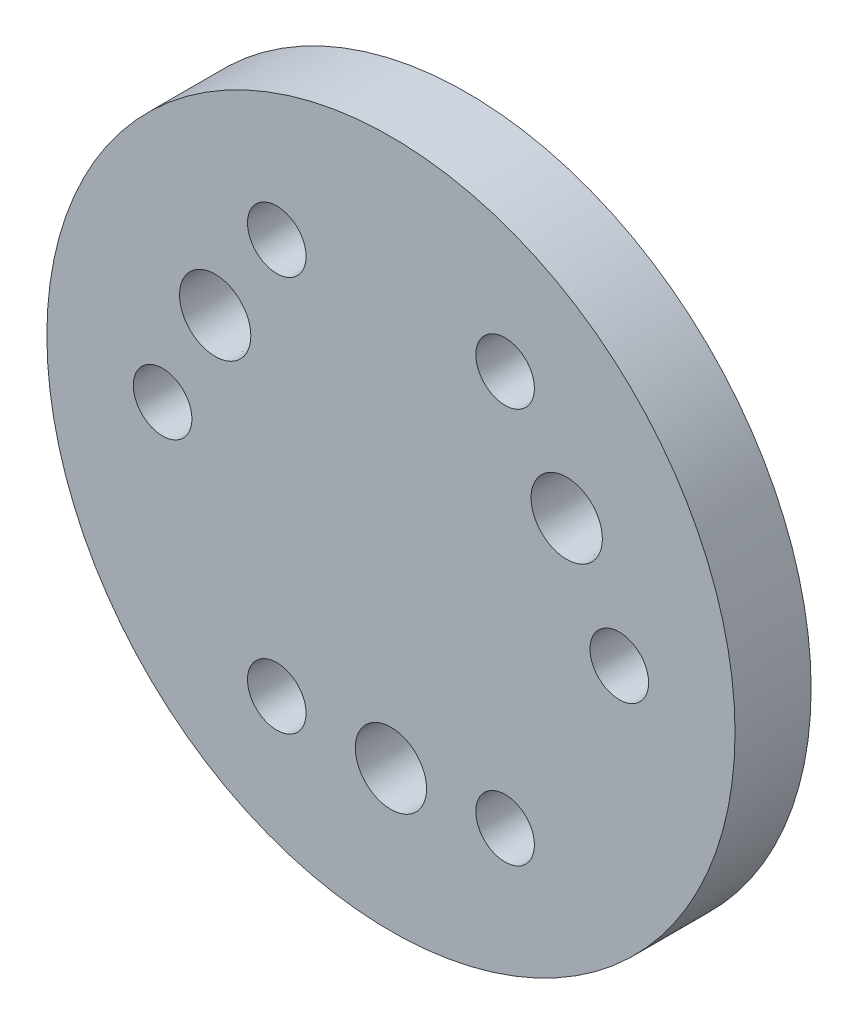
ISO-10303-21;
HEADER;
FILE_DESCRIPTION(('STEP AP214'),'2;1');
FILE_NAME('part.step','',(''),(''),'','','');
FILE_SCHEMA(('AUTOMOTIVE_DESIGN { 1 0 10303 214 1 1 1 1 }'));
ENDSEC;
DATA;
#1=APPLICATION_CONTEXT('core data for automotive mechanical design processes');
#2=APPLICATION_PROTOCOL_DEFINITION('international standard','automotive_design',2000,#1);
#3=PRODUCT_CONTEXT('',#1,'mechanical');
#4=PRODUCT('Part','Part','',(#3));
#5=PRODUCT_RELATED_PRODUCT_CATEGORY('part','',(#4));
#6=PRODUCT_DEFINITION_FORMATION('','',#4);
#7=PRODUCT_DEFINITION_CONTEXT('part definition',#1,'design');
#8=PRODUCT_DEFINITION('design','',#6,#7);
#9=PRODUCT_DEFINITION_SHAPE('','',#8);
#10=(LENGTH_UNIT() NAMED_UNIT(*) SI_UNIT(.MILLI.,.METRE.));
#11=(NAMED_UNIT(*) PLANE_ANGLE_UNIT() SI_UNIT($,.RADIAN.));
#12=(NAMED_UNIT(*) SI_UNIT($,.STERADIAN.) SOLID_ANGLE_UNIT());
#13=UNCERTAINTY_MEASURE_WITH_UNIT(LENGTH_MEASURE(1.E-05),#10,'distance_accuracy_value','');
#14=(GEOMETRIC_REPRESENTATION_CONTEXT(3) GLOBAL_UNCERTAINTY_ASSIGNED_CONTEXT((#13)) GLOBAL_UNIT_ASSIGNED_CONTEXT((#10,
#11,#12)) REPRESENTATION_CONTEXT('',''));
#15=CARTESIAN_POINT('',(0.,0.,0.));
#16=DIRECTION('',(0.,0.,1.));
#17=DIRECTION('',(1.,0.,0.));
#18=AXIS2_PLACEMENT_3D('',#15,#16,#17);
#19=CARTESIAN_POINT('',(0.,0.,6.));
#20=DIRECTION('',(0.,0.,-1.));
#21=DIRECTION('',(-1.,0.,0.));
#22=AXIS2_PLACEMENT_3D('',#19,#20,#21);
#23=CYLINDRICAL_SURFACE('',#22,27.125);
#24=CARTESIAN_POINT('',(0.,0.,6.));
#25=DIRECTION('',(0.,0.,1.));
#26=DIRECTION('',(1.,0.,0.));
#27=AXIS2_PLACEMENT_3D('',#24,#25,#26);
#28=CIRCLE('',#27,27.125);
#29=CARTESIAN_POINT('',(27.125,0.,6.));
#30=VERTEX_POINT('',#29);
#31=EDGE_CURVE('E10',#30,#30,#28,.T.);
#32=ORIENTED_EDGE('',*,*,#31,.F.);
#33=EDGE_LOOP('',(#32));
#34=FACE_BOUND('',#33,.T.);
#35=CARTESIAN_POINT('',(0.,0.,0.));
#36=DIRECTION('',(0.,0.,1.));
#37=DIRECTION('',(1.,0.,0.));
#38=AXIS2_PLACEMENT_3D('',#35,#36,#37);
#39=CIRCLE('',#38,27.125);
#40=CARTESIAN_POINT('',(27.125,0.,0.));
#41=VERTEX_POINT('',#40);
#42=EDGE_CURVE('E45',#41,#41,#39,.T.);
#43=ORIENTED_EDGE('',*,*,#42,.T.);
#44=EDGE_LOOP('',(#43));
#45=FACE_BOUND('',#44,.T.);
#46=ADVANCED_FACE('F42',(#34,#45),#23,.T.);
#47=CARTESIAN_POINT('',(0.,0.,6.));
#48=DIRECTION('',(0.,0.,1.));
#49=DIRECTION('',(1.,0.,0.));
#50=AXIS2_PLACEMENT_3D('',#47,#48,#49);
#51=PLANE('',#50);
#52=CARTESIAN_POINT('',(18.,0.,6.));
#53=DIRECTION('',(0.,0.,1.));
#54=DIRECTION('',(1.,0.,0.));
#55=AXIS2_PLACEMENT_3D('',#52,#53,#54);
#56=CIRCLE('',#55,2.30952461695048);
#57=CARTESIAN_POINT('',(20.3095246169505,0.,6.));
#58=VERTEX_POINT('',#57);
#59=EDGE_CURVE('E72',#58,#58,#56,.T.);
#60=ORIENTED_EDGE('',*,*,#59,.F.);
#61=EDGE_LOOP('',(#60));
#62=FACE_BOUND('',#61,.T.);
#63=CARTESIAN_POINT('',(-9.,15.5884572681199,6.));
#64=DIRECTION('',(0.,0.,1.));
#65=DIRECTION('',(1.,0.,0.));
#66=AXIS2_PLACEMENT_3D('',#63,#64,#65);
#67=CIRCLE('',#66,2.30952461695049);
#68=CARTESIAN_POINT('',(-6.69047538304951,15.5884572681199,6.));
#69=VERTEX_POINT('',#68);
#70=EDGE_CURVE('E67',#69,#69,#67,.T.);
#71=ORIENTED_EDGE('',*,*,#70,.F.);
#72=EDGE_LOOP('',(#71));
#73=FACE_BOUND('',#72,.T.);
#74=CARTESIAN_POINT('',(-13.856406460551,8.,6.));
#75=DIRECTION('',(0.,0.,1.));
#76=DIRECTION('',(1.,0.,0.));
#77=AXIS2_PLACEMENT_3D('',#74,#75,#76);
#78=CIRCLE('',#77,2.80952461695049);
#79=CARTESIAN_POINT('',(-11.0468818436005,8.,6.));
#80=VERTEX_POINT('',#79);
#81=EDGE_CURVE('E60',#80,#80,#78,.T.);
#82=ORIENTED_EDGE('',*,*,#81,.F.);
#83=EDGE_LOOP('',(#82));
#84=FACE_BOUND('',#83,.T.);
#85=CARTESIAN_POINT('',(13.856406460551,8.,6.));
#86=DIRECTION('',(0.,0.,1.));
#87=DIRECTION('',(1.,0.,0.));
#88=AXIS2_PLACEMENT_3D('',#85,#86,#87);
#89=CIRCLE('',#88,2.80952461695049);
#90=CARTESIAN_POINT('',(16.6659310775015,8.,6.));
#91=VERTEX_POINT('',#90);
#92=EDGE_CURVE('E59',#91,#91,#89,.T.);
#93=ORIENTED_EDGE('',*,*,#92,.F.);
#94=EDGE_LOOP('',(#93));
#95=FACE_BOUND('',#94,.T.);
#96=CARTESIAN_POINT('',(-18.,0.,6.));
#97=DIRECTION('',(0.,0.,1.));
#98=DIRECTION('',(1.,0.,0.));
#99=AXIS2_PLACEMENT_3D('',#96,#97,#98);
#100=CIRCLE('',#99,2.30952461695048);
#101=CARTESIAN_POINT('',(-15.6904753830495,0.,6.));
#102=VERTEX_POINT('',#101);
#103=EDGE_CURVE('E79',#102,#102,#100,.T.);
#104=ORIENTED_EDGE('',*,*,#103,.F.);
#105=EDGE_LOOP('',(#104));
#106=FACE_BOUND('',#105,.T.);
#107=CARTESIAN_POINT('',(-9.,-15.5884572681199,6.));
#108=DIRECTION('',(0.,0.,1.));
#109=DIRECTION('',(1.,0.,0.));
#110=AXIS2_PLACEMENT_3D('',#107,#108,#109);
#111=CIRCLE('',#110,2.30952461695049);
#112=CARTESIAN_POINT('',(-6.69047538304951,-15.5884572681199,6.));
#113=VERTEX_POINT('',#112);
#114=EDGE_CURVE('E97',#113,#113,#111,.T.);
#115=ORIENTED_EDGE('',*,*,#114,.F.);
#116=EDGE_LOOP('',(#115));
#117=FACE_BOUND('',#116,.T.);
#118=CARTESIAN_POINT('',(9.,-15.5884572681199,6.));
#119=DIRECTION('',(0.,0.,1.));
#120=DIRECTION('',(1.,0.,0.));
#121=AXIS2_PLACEMENT_3D('',#118,#119,#120);
#122=CIRCLE('',#121,2.30952461695049);
#123=CARTESIAN_POINT('',(11.3095246169505,-15.5884572681199,6.));
#124=VERTEX_POINT('',#123);
#125=EDGE_CURVE('E91',#124,#124,#122,.T.);
#126=ORIENTED_EDGE('',*,*,#125,.F.);
#127=EDGE_LOOP('',(#126));
#128=FACE_BOUND('',#127,.T.);
#129=CARTESIAN_POINT('',(9.,15.5884572681199,6.));
#130=DIRECTION('',(0.,0.,1.));
#131=DIRECTION('',(1.,0.,0.));
#132=AXIS2_PLACEMENT_3D('',#129,#130,#131);
#133=CIRCLE('',#132,2.30952461695048);
#134=CARTESIAN_POINT('',(11.3095246169505,15.5884572681199,6.));
#135=VERTEX_POINT('',#134);
#136=EDGE_CURVE('E84',#135,#135,#133,.T.);
#137=ORIENTED_EDGE('',*,*,#136,.F.);
#138=EDGE_LOOP('',(#137));
#139=FACE_BOUND('',#138,.T.);
#140=CARTESIAN_POINT('',(0.,-16.,6.));
#141=DIRECTION('',(0.,0.,1.));
#142=DIRECTION('',(1.,0.,0.));
#143=AXIS2_PLACEMENT_3D('',#140,#141,#142);
#144=CIRCLE('',#143,2.80952461695049);
#145=CARTESIAN_POINT('',(2.80952461695049,-16.,6.));
#146=VERTEX_POINT('',#145);
#147=EDGE_CURVE('E52',#146,#146,#144,.T.);
#148=ORIENTED_EDGE('',*,*,#147,.F.);
#149=EDGE_LOOP('',(#148));
#150=FACE_BOUND('',#149,.T.);
#151=ORIENTED_EDGE('',*,*,#31,.T.);
#152=EDGE_LOOP('',(#151));
#153=FACE_BOUND('',#152,.T.);
#154=ADVANCED_FACE('F128',(#62,#73,#84,#95,#106,#117,#128,#139,#150,#153),#51,.T.);
#155=CARTESIAN_POINT('',(0.,0.,0.));
#156=DIRECTION('',(0.,0.,1.));
#157=DIRECTION('',(1.,0.,0.));
#158=AXIS2_PLACEMENT_3D('',#155,#156,#157);
#159=PLANE('',#158);
#160=CARTESIAN_POINT('',(18.,0.,0.));
#161=DIRECTION('',(0.,0.,1.));
#162=DIRECTION('',(1.,0.,0.));
#163=AXIS2_PLACEMENT_3D('',#160,#161,#162);
#164=CIRCLE('',#163,2.1);
#165=CARTESIAN_POINT('',(20.1,0.,0.));
#166=VERTEX_POINT('',#165);
#167=EDGE_CURVE('E76',#166,#166,#164,.T.);
#168=ORIENTED_EDGE('',*,*,#167,.T.);
#169=EDGE_LOOP('',(#168));
#170=FACE_BOUND('',#169,.T.);
#171=CARTESIAN_POINT('',(-9.,15.5884572681199,0.));
#172=DIRECTION('',(0.,0.,1.));
#173=DIRECTION('',(1.,0.,0.));
#174=AXIS2_PLACEMENT_3D('',#171,#172,#173);
#175=CIRCLE('',#174,2.1);
#176=CARTESIAN_POINT('',(-6.9,15.5884572681199,0.));
#177=VERTEX_POINT('',#176);
#178=EDGE_CURVE('E75',#177,#177,#175,.T.);
#179=ORIENTED_EDGE('',*,*,#178,.T.);
#180=EDGE_LOOP('',(#179));
#181=FACE_BOUND('',#180,.T.);
#182=CARTESIAN_POINT('',(-13.856406460551,8.,0.));
#183=DIRECTION('',(0.,0.,1.));
#184=DIRECTION('',(1.,0.,0.));
#185=AXIS2_PLACEMENT_3D('',#182,#183,#184);
#186=CIRCLE('',#185,2.6);
#187=CARTESIAN_POINT('',(-11.256406460551,8.,0.));
#188=VERTEX_POINT('',#187);
#189=EDGE_CURVE('E64',#188,#188,#186,.T.);
#190=ORIENTED_EDGE('',*,*,#189,.T.);
#191=EDGE_LOOP('',(#190));
#192=FACE_BOUND('',#191,.T.);
#193=CARTESIAN_POINT('',(13.856406460551,8.,0.));
#194=DIRECTION('',(0.,0.,1.));
#195=DIRECTION('',(1.,0.,0.));
#196=AXIS2_PLACEMENT_3D('',#193,#194,#195);
#197=CIRCLE('',#196,2.6);
#198=CARTESIAN_POINT('',(16.456406460551,8.,0.));
#199=VERTEX_POINT('',#198);
#200=EDGE_CURVE('E63',#199,#199,#197,.T.);
#201=ORIENTED_EDGE('',*,*,#200,.T.);
#202=EDGE_LOOP('',(#201));
#203=FACE_BOUND('',#202,.T.);
#204=CARTESIAN_POINT('',(-18.,0.,0.));
#205=DIRECTION('',(0.,0.,1.));
#206=DIRECTION('',(1.,0.,0.));
#207=AXIS2_PLACEMENT_3D('',#204,#205,#206);
#208=CIRCLE('',#207,2.1);
#209=CARTESIAN_POINT('',(-15.9,0.,0.));
#210=VERTEX_POINT('',#209);
#211=EDGE_CURVE('E100',#210,#210,#208,.T.);
#212=ORIENTED_EDGE('',*,*,#211,.T.);
#213=EDGE_LOOP('',(#212));
#214=FACE_BOUND('',#213,.T.);
#215=CARTESIAN_POINT('',(-9.,-15.5884572681199,0.));
#216=DIRECTION('',(0.,0.,1.));
#217=DIRECTION('',(1.,0.,0.));
#218=AXIS2_PLACEMENT_3D('',#215,#216,#217);
#219=CIRCLE('',#218,2.1);
#220=CARTESIAN_POINT('',(-6.9,-15.5884572681199,0.));
#221=VERTEX_POINT('',#220);
#222=EDGE_CURVE('E94',#221,#221,#219,.T.);
#223=ORIENTED_EDGE('',*,*,#222,.T.);
#224=EDGE_LOOP('',(#223));
#225=FACE_BOUND('',#224,.T.);
#226=CARTESIAN_POINT('',(9.,-15.5884572681199,0.));
#227=DIRECTION('',(0.,0.,1.));
#228=DIRECTION('',(1.,0.,0.));
#229=AXIS2_PLACEMENT_3D('',#226,#227,#228);
#230=CIRCLE('',#229,2.1);
#231=CARTESIAN_POINT('',(11.1,-15.5884572681199,0.));
#232=VERTEX_POINT('',#231);
#233=EDGE_CURVE('E87',#232,#232,#230,.T.);
#234=ORIENTED_EDGE('',*,*,#233,.T.);
#235=EDGE_LOOP('',(#234));
#236=FACE_BOUND('',#235,.T.);
#237=CARTESIAN_POINT('',(9.,15.5884572681199,0.));
#238=DIRECTION('',(0.,0.,1.));
#239=DIRECTION('',(1.,0.,0.));
#240=AXIS2_PLACEMENT_3D('',#237,#238,#239);
#241=CIRCLE('',#240,2.1);
#242=CARTESIAN_POINT('',(11.1,15.5884572681199,0.));
#243=VERTEX_POINT('',#242);
#244=EDGE_CURVE('E88',#243,#243,#241,.T.);
#245=ORIENTED_EDGE('',*,*,#244,.T.);
#246=EDGE_LOOP('',(#245));
#247=FACE_BOUND('',#246,.T.);
#248=CARTESIAN_POINT('',(0.,-16.,0.));
#249=DIRECTION('',(0.,0.,1.));
#250=DIRECTION('',(1.,0.,0.));
#251=AXIS2_PLACEMENT_3D('',#248,#249,#250);
#252=CIRCLE('',#251,2.6);
#253=CARTESIAN_POINT('',(2.6,-16.,0.));
#254=VERTEX_POINT('',#253);
#255=EDGE_CURVE('E56',#254,#254,#252,.T.);
#256=ORIENTED_EDGE('',*,*,#255,.T.);
#257=EDGE_LOOP('',(#256));
#258=FACE_BOUND('',#257,.T.);
#259=ORIENTED_EDGE('',*,*,#42,.F.);
#260=EDGE_LOOP('',(#259));
#261=FACE_BOUND('',#260,.T.);
#262=ADVANCED_FACE('F108',(#170,#181,#192,#203,#214,#225,#236,#247,#258,#261),#159,.F.);
#263=CARTESIAN_POINT('',(0.,-16.,0.));
#264=DIRECTION('',(0.,0.,1.));
#265=DIRECTION('',(1.,0.,0.));
#266=AXIS2_PLACEMENT_3D('',#263,#264,#265);
#267=CONICAL_SURFACE('',#266,2.6,0.0349065850398867);
#268=ORIENTED_EDGE('',*,*,#147,.T.);
#269=EDGE_LOOP('',(#268));
#270=FACE_BOUND('',#269,.T.);
#271=ORIENTED_EDGE('',*,*,#255,.F.);
#272=EDGE_LOOP('',(#271));
#273=FACE_BOUND('',#272,.T.);
#274=ADVANCED_FACE('F139',(#270,#273),#267,.F.);
#275=CARTESIAN_POINT('',(9.,15.5884572681199,0.));
#276=DIRECTION('',(0.,0.,1.));
#277=DIRECTION('',(1.,0.,0.));
#278=AXIS2_PLACEMENT_3D('',#275,#276,#277);
#279=CONICAL_SURFACE('',#278,2.1,0.0349065850398867);
#280=ORIENTED_EDGE('',*,*,#136,.T.);
#281=EDGE_LOOP('',(#280));
#282=FACE_BOUND('',#281,.T.);
#283=ORIENTED_EDGE('',*,*,#244,.F.);
#284=EDGE_LOOP('',(#283));
#285=FACE_BOUND('',#284,.T.);
#286=ADVANCED_FACE('F144',(#282,#285),#279,.F.);
#287=CARTESIAN_POINT('',(9.,-15.5884572681199,0.));
#288=DIRECTION('',(0.,0.,1.));
#289=DIRECTION('',(1.,0.,0.));
#290=AXIS2_PLACEMENT_3D('',#287,#288,#289);
#291=CONICAL_SURFACE('',#290,2.1,0.0349065850398867);
#292=ORIENTED_EDGE('',*,*,#125,.T.);
#293=EDGE_LOOP('',(#292));
#294=FACE_BOUND('',#293,.T.);
#295=ORIENTED_EDGE('',*,*,#233,.F.);
#296=EDGE_LOOP('',(#295));
#297=FACE_BOUND('',#296,.T.);
#298=ADVANCED_FACE('F124',(#294,#297),#291,.F.);
#299=CARTESIAN_POINT('',(-9.,-15.5884572681199,0.));
#300=DIRECTION('',(0.,0.,1.));
#301=DIRECTION('',(1.,0.,0.));
#302=AXIS2_PLACEMENT_3D('',#299,#300,#301);
#303=CONICAL_SURFACE('',#302,2.1,0.0349065850398867);
#304=ORIENTED_EDGE('',*,*,#114,.T.);
#305=EDGE_LOOP('',(#304));
#306=FACE_BOUND('',#305,.T.);
#307=ORIENTED_EDGE('',*,*,#222,.F.);
#308=EDGE_LOOP('',(#307));
#309=FACE_BOUND('',#308,.T.);
#310=ADVANCED_FACE('F114',(#306,#309),#303,.F.);
#311=CARTESIAN_POINT('',(-18.,0.,0.));
#312=DIRECTION('',(0.,0.,1.));
#313=DIRECTION('',(1.,0.,0.));
#314=AXIS2_PLACEMENT_3D('',#311,#312,#313);
#315=CONICAL_SURFACE('',#314,2.1,0.0349065850398867);
#316=ORIENTED_EDGE('',*,*,#103,.T.);
#317=EDGE_LOOP('',(#316));
#318=FACE_BOUND('',#317,.T.);
#319=ORIENTED_EDGE('',*,*,#211,.F.);
#320=EDGE_LOOP('',(#319));
#321=FACE_BOUND('',#320,.T.);
#322=ADVANCED_FACE('F111',(#318,#321),#315,.F.);
#323=CARTESIAN_POINT('',(13.856406460551,8.,0.));
#324=DIRECTION('',(0.,0.,1.));
#325=DIRECTION('',(1.,0.,0.));
#326=AXIS2_PLACEMENT_3D('',#323,#324,#325);
#327=CONICAL_SURFACE('',#326,2.6,0.0349065850398867);
#328=ORIENTED_EDGE('',*,*,#92,.T.);
#329=EDGE_LOOP('',(#328));
#330=FACE_BOUND('',#329,.T.);
#331=ORIENTED_EDGE('',*,*,#200,.F.);
#332=EDGE_LOOP('',(#331));
#333=FACE_BOUND('',#332,.T.);
#334=ADVANCED_FACE('F113',(#330,#333),#327,.F.);
#335=CARTESIAN_POINT('',(-13.856406460551,8.,0.));
#336=DIRECTION('',(0.,0.,1.));
#337=DIRECTION('',(1.,0.,0.));
#338=AXIS2_PLACEMENT_3D('',#335,#336,#337);
#339=CONICAL_SURFACE('',#338,2.6,0.0349065850398867);
#340=ORIENTED_EDGE('',*,*,#81,.T.);
#341=EDGE_LOOP('',(#340));
#342=FACE_BOUND('',#341,.T.);
#343=ORIENTED_EDGE('',*,*,#189,.F.);
#344=EDGE_LOOP('',(#343));
#345=FACE_BOUND('',#344,.T.);
#346=ADVANCED_FACE('F121',(#342,#345),#339,.F.);
#347=CARTESIAN_POINT('',(-9.,15.5884572681199,0.));
#348=DIRECTION('',(0.,0.,1.));
#349=DIRECTION('',(1.,0.,0.));
#350=AXIS2_PLACEMENT_3D('',#347,#348,#349);
#351=CONICAL_SURFACE('',#350,2.1,0.0349065850398867);
#352=ORIENTED_EDGE('',*,*,#70,.T.);
#353=EDGE_LOOP('',(#352));
#354=FACE_BOUND('',#353,.T.);
#355=ORIENTED_EDGE('',*,*,#178,.F.);
#356=EDGE_LOOP('',(#355));
#357=FACE_BOUND('',#356,.T.);
#358=ADVANCED_FACE('F150',(#354,#357),#351,.F.);
#359=CARTESIAN_POINT('',(18.,0.,0.));
#360=DIRECTION('',(0.,0.,1.));
#361=DIRECTION('',(1.,0.,0.));
#362=AXIS2_PLACEMENT_3D('',#359,#360,#361);
#363=CONICAL_SURFACE('',#362,2.1,0.0349065850398867);
#364=ORIENTED_EDGE('',*,*,#59,.T.);
#365=EDGE_LOOP('',(#364));
#366=FACE_BOUND('',#365,.T.);
#367=ORIENTED_EDGE('',*,*,#167,.F.);
#368=EDGE_LOOP('',(#367));
#369=FACE_BOUND('',#368,.T.);
#370=ADVANCED_FACE('F153',(#366,#369),#363,.F.);
#371=CLOSED_SHELL('',(#46,#154,#262,#274,#286,#298,#310,#322,#334,#346,#358,#370));
#372=MANIFOLD_SOLID_BREP('B2',#371);
#373=ADVANCED_BREP_SHAPE_REPRESENTATION('',(#18,#372),#14);
#374=SHAPE_DEFINITION_REPRESENTATION(#9,#373);
ENDSEC;
END-ISO-10303-21;
